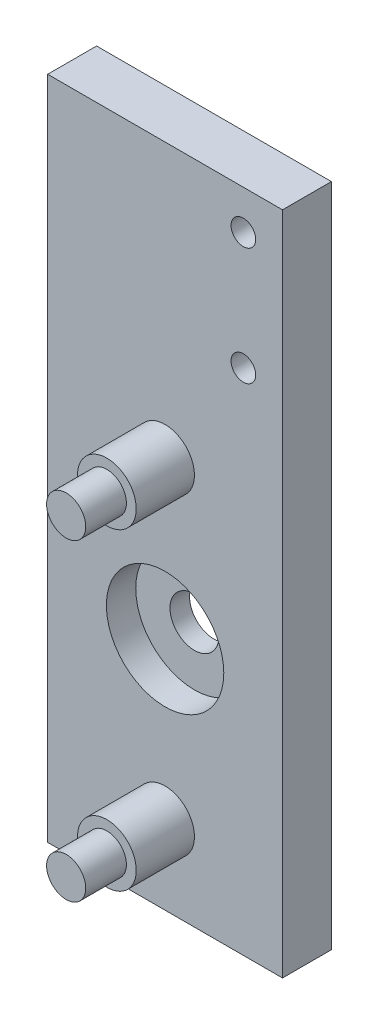
ISO-10303-21;
HEADER;
FILE_DESCRIPTION(('STEP AP214'),'2;1');
FILE_NAME('part.step','',(''),(''),'','','');
FILE_SCHEMA(('AUTOMOTIVE_DESIGN { 1 0 10303 214 1 1 1 1 }'));
ENDSEC;
DATA;
#1=APPLICATION_CONTEXT('core data for automotive mechanical design processes');
#2=APPLICATION_PROTOCOL_DEFINITION('international standard','automotive_design',2000,#1);
#3=PRODUCT_CONTEXT('',#1,'mechanical');
#4=PRODUCT('Part','Part','',(#3));
#5=PRODUCT_RELATED_PRODUCT_CATEGORY('part','',(#4));
#6=PRODUCT_DEFINITION_FORMATION('','',#4);
#7=PRODUCT_DEFINITION_CONTEXT('part definition',#1,'design');
#8=PRODUCT_DEFINITION('design','',#6,#7);
#9=PRODUCT_DEFINITION_SHAPE('','',#8);
#10=(LENGTH_UNIT() NAMED_UNIT(*) SI_UNIT(.MILLI.,.METRE.));
#11=(NAMED_UNIT(*) PLANE_ANGLE_UNIT() SI_UNIT($,.RADIAN.));
#12=(NAMED_UNIT(*) SI_UNIT($,.STERADIAN.) SOLID_ANGLE_UNIT());
#13=UNCERTAINTY_MEASURE_WITH_UNIT(LENGTH_MEASURE(1.E-05),#10,'distance_accuracy_value','');
#14=(GEOMETRIC_REPRESENTATION_CONTEXT(3) GLOBAL_UNCERTAINTY_ASSIGNED_CONTEXT((#13)) GLOBAL_UNIT_ASSIGNED_CONTEXT((#10,
#11,#12)) REPRESENTATION_CONTEXT('',''));
#15=CARTESIAN_POINT('',(0.,0.,0.));
#16=DIRECTION('',(0.,0.,1.));
#17=DIRECTION('',(1.,0.,0.));
#18=AXIS2_PLACEMENT_3D('',#15,#16,#17);
#19=CARTESIAN_POINT('',(19.05,-38.1,7.9375));
#20=DIRECTION('',(-1.,0.,0.));
#21=DIRECTION('',(0.,0.,1.));
#22=AXIS2_PLACEMENT_3D('',#19,#20,#21);
#23=PLANE('',#22);
#24=DIRECTION('',(0.,1.,0.));
#25=VECTOR('',#24,1.);
#26=CARTESIAN_POINT('',(19.05,-38.1,0.));
#27=LINE('',#26,#25);
#28=CARTESIAN_POINT('',(19.05,-38.1,0.));
#29=VERTEX_POINT('',#28);
#30=CARTESIAN_POINT('',(19.05,69.85,0.));
#31=VERTEX_POINT('',#30);
#32=EDGE_CURVE('E78',#29,#31,#27,.T.);
#33=ORIENTED_EDGE('',*,*,#32,.T.);
#34=DIRECTION('',(0.,0.,1.));
#35=VECTOR('',#34,1.);
#36=CARTESIAN_POINT('',(19.05,69.85,-49.5950854420072));
#37=LINE('',#36,#35);
#38=CARTESIAN_POINT('',(19.05,69.85,7.9375));
#39=VERTEX_POINT('',#38);
#40=EDGE_CURVE('E101',#31,#39,#37,.T.);
#41=ORIENTED_EDGE('',*,*,#40,.T.);
#42=DIRECTION('',(0.,1.,0.));
#43=VECTOR('',#42,1.);
#44=CARTESIAN_POINT('',(19.05,-38.1,7.9375));
#45=LINE('',#44,#43);
#46=CARTESIAN_POINT('',(19.05,-38.1,7.9375));
#47=VERTEX_POINT('',#46);
#48=EDGE_CURVE('E93',#47,#39,#45,.T.);
#49=ORIENTED_EDGE('',*,*,#48,.F.);
#50=DIRECTION('',(0.,0.,-1.));
#51=VECTOR('',#50,1.);
#52=CARTESIAN_POINT('',(19.05,-38.1,7.9375));
#53=LINE('',#52,#51);
#54=EDGE_CURVE('E153',#47,#29,#53,.T.);
#55=ORIENTED_EDGE('',*,*,#54,.T.);
#56=EDGE_LOOP('',(#33,#41,#49,#55));
#57=FACE_BOUND('',#56,.T.);
#58=ADVANCED_FACE('F41',(#57),#23,.F.);
#59=CARTESIAN_POINT('',(-19.05,-38.1,7.9375));
#60=DIRECTION('',(1.,0.,0.));
#61=DIRECTION('',(0.,0.,-1.));
#62=AXIS2_PLACEMENT_3D('',#59,#60,#61);
#63=PLANE('',#62);
#64=DIRECTION('',(0.,-1.,0.));
#65=VECTOR('',#64,1.);
#66=CARTESIAN_POINT('',(-19.05,-38.1,0.));
#67=LINE('',#66,#65);
#68=CARTESIAN_POINT('',(-19.05,69.85,0.));
#69=VERTEX_POINT('',#68);
#70=CARTESIAN_POINT('',(-19.05,-38.1,0.));
#71=VERTEX_POINT('',#70);
#72=EDGE_CURVE('E69',#69,#71,#67,.T.);
#73=ORIENTED_EDGE('',*,*,#72,.T.);
#74=DIRECTION('',(0.,0.,-1.));
#75=VECTOR('',#74,1.);
#76=CARTESIAN_POINT('',(-19.05,-38.1,7.9375));
#77=LINE('',#76,#75);
#78=CARTESIAN_POINT('',(-19.05,-38.1,7.9375));
#79=VERTEX_POINT('',#78);
#80=EDGE_CURVE('E91',#79,#71,#77,.T.);
#81=ORIENTED_EDGE('',*,*,#80,.F.);
#82=DIRECTION('',(0.,-1.,0.));
#83=VECTOR('',#82,1.);
#84=CARTESIAN_POINT('',(-19.05,-38.1,7.9375));
#85=LINE('',#84,#83);
#86=CARTESIAN_POINT('',(-19.05,69.85,7.9375));
#87=VERTEX_POINT('',#86);
#88=EDGE_CURVE('E86',#87,#79,#85,.T.);
#89=ORIENTED_EDGE('',*,*,#88,.F.);
#90=DIRECTION('',(0.,0.,1.));
#91=VECTOR('',#90,1.);
#92=CARTESIAN_POINT('',(-19.05,69.85,-49.5950854420072));
#93=LINE('',#92,#91);
#94=EDGE_CURVE('E89',#69,#87,#93,.T.);
#95=ORIENTED_EDGE('',*,*,#94,.F.);
#96=EDGE_LOOP('',(#73,#81,#89,#95));
#97=FACE_BOUND('',#96,.T.);
#98=ADVANCED_FACE('F88',(#97),#63,.F.);
#99=CARTESIAN_POINT('',(-19.05,-38.1,7.9375));
#100=DIRECTION('',(0.,1.,0.));
#101=DIRECTION('',(0.,0.,1.));
#102=AXIS2_PLACEMENT_3D('',#99,#100,#101);
#103=PLANE('',#102);
#104=DIRECTION('',(1.,0.,0.));
#105=VECTOR('',#104,1.);
#106=CARTESIAN_POINT('',(-19.05,-38.1,0.));
#107=LINE('',#106,#105);
#108=EDGE_CURVE('E150',#71,#29,#107,.T.);
#109=ORIENTED_EDGE('',*,*,#108,.T.);
#110=ORIENTED_EDGE('',*,*,#54,.F.);
#111=DIRECTION('',(1.,0.,0.));
#112=VECTOR('',#111,1.);
#113=CARTESIAN_POINT('',(-19.05,-38.1,7.9375));
#114=LINE('',#113,#112);
#115=EDGE_CURVE('E58',#79,#47,#114,.T.);
#116=ORIENTED_EDGE('',*,*,#115,.F.);
#117=ORIENTED_EDGE('',*,*,#80,.T.);
#118=EDGE_LOOP('',(#109,#110,#116,#117));
#119=FACE_BOUND('',#118,.T.);
#120=ADVANCED_FACE('F183',(#119),#103,.F.);
#121=CARTESIAN_POINT('',(0.,0.,7.9375));
#122=DIRECTION('',(0.,0.,-1.));
#123=DIRECTION('',(-1.,0.,0.));
#124=AXIS2_PLACEMENT_3D('',#121,#122,#123);
#125=PLANE('',#124);
#126=CARTESIAN_POINT('',(0.,-25.4,7.9375));
#127=DIRECTION('',(0.,0.,-1.));
#128=DIRECTION('',(1.,0.,0.));
#129=AXIS2_PLACEMENT_3D('',#126,#127,#128);
#130=CIRCLE('',#129,4.7625);
#131=CARTESIAN_POINT('',(4.7625,-25.4,7.9375));
#132=VERTEX_POINT('',#131);
#133=EDGE_CURVE('E126',#132,#132,#130,.T.);
#134=ORIENTED_EDGE('',*,*,#133,.T.);
#135=EDGE_LOOP('',(#134));
#136=FACE_BOUND('',#135,.T.);
#137=CARTESIAN_POINT('',(0.,25.4,7.9375));
#138=DIRECTION('',(0.,0.,-1.));
#139=DIRECTION('',(-1.,0.,0.));
#140=AXIS2_PLACEMENT_3D('',#137,#138,#139);
#141=CIRCLE('',#140,4.7625);
#142=CARTESIAN_POINT('',(-4.7625,25.4,7.9375));
#143=VERTEX_POINT('',#142);
#144=EDGE_CURVE('E44',#143,#143,#141,.F.);
#145=ORIENTED_EDGE('',*,*,#144,.F.);
#146=EDGE_LOOP('',(#145));
#147=FACE_BOUND('',#146,.T.);
#148=CARTESIAN_POINT('',(0.,0.,7.9375));
#149=DIRECTION('',(0.,0.,1.));
#150=DIRECTION('',(1.,0.,0.));
#151=AXIS2_PLACEMENT_3D('',#148,#149,#150);
#152=CIRCLE('',#151,9.525);
#153=CARTESIAN_POINT('',(9.525,0.,7.9375));
#154=VERTEX_POINT('',#153);
#155=EDGE_CURVE('E140',#154,#154,#152,.T.);
#156=ORIENTED_EDGE('',*,*,#155,.F.);
#157=EDGE_LOOP('',(#156));
#158=FACE_BOUND('',#157,.T.);
#159=ORIENTED_EDGE('',*,*,#48,.T.);
#160=DIRECTION('',(-1.,0.,0.));
#161=VECTOR('',#160,1.);
#162=CARTESIAN_POINT('',(-19.05,69.85,7.9375));
#163=LINE('',#162,#161);
#164=EDGE_CURVE('E99',#39,#87,#163,.T.);
#165=ORIENTED_EDGE('',*,*,#164,.T.);
#166=ORIENTED_EDGE('',*,*,#88,.T.);
#167=ORIENTED_EDGE('',*,*,#115,.T.);
#168=EDGE_LOOP('',(#159,#165,#166,#167));
#169=FACE_BOUND('',#168,.T.);
#170=CARTESIAN_POINT('',(12.7,44.45,7.9375));
#171=DIRECTION('',(0.,0.,1.));
#172=DIRECTION('',(-1.,0.,0.));
#173=AXIS2_PLACEMENT_3D('',#170,#171,#172);
#174=CIRCLE('',#173,2.);
#175=CARTESIAN_POINT('',(10.7,44.45,7.9375));
#176=VERTEX_POINT('',#175);
#177=EDGE_CURVE('E107',#176,#176,#174,.T.);
#178=ORIENTED_EDGE('',*,*,#177,.F.);
#179=EDGE_LOOP('',(#178));
#180=FACE_BOUND('',#179,.T.);
#181=CARTESIAN_POINT('',(12.7,63.5,7.9375));
#182=DIRECTION('',(0.,0.,1.));
#183=DIRECTION('',(1.,0.,0.));
#184=AXIS2_PLACEMENT_3D('',#181,#182,#183);
#185=CIRCLE('',#184,2.);
#186=CARTESIAN_POINT('',(14.7,63.5,7.9375));
#187=VERTEX_POINT('',#186);
#188=EDGE_CURVE('E113',#187,#187,#185,.T.);
#189=ORIENTED_EDGE('',*,*,#188,.F.);
#190=EDGE_LOOP('',(#189));
#191=FACE_BOUND('',#190,.T.);
#192=ADVANCED_FACE('F103',(#136,#147,#158,#169,#180,#191),#125,.F.);
#193=CARTESIAN_POINT('',(0.,0.,0.));
#194=DIRECTION('',(0.,0.,-1.));
#195=DIRECTION('',(-1.,0.,0.));
#196=AXIS2_PLACEMENT_3D('',#193,#194,#195);
#197=PLANE('',#196);
#198=CARTESIAN_POINT('',(0.,0.,0.));
#199=DIRECTION('',(0.,0.,1.));
#200=DIRECTION('',(1.,0.,0.));
#201=AXIS2_PLACEMENT_3D('',#198,#199,#200);
#202=CIRCLE('',#201,3.96875);
#203=CARTESIAN_POINT('',(3.96875,0.,0.));
#204=VERTEX_POINT('',#203);
#205=EDGE_CURVE('E147',#204,#204,#202,.T.);
#206=ORIENTED_EDGE('',*,*,#205,.T.);
#207=EDGE_LOOP('',(#206));
#208=FACE_BOUND('',#207,.T.);
#209=ORIENTED_EDGE('',*,*,#32,.F.);
#210=ORIENTED_EDGE('',*,*,#108,.F.);
#211=ORIENTED_EDGE('',*,*,#72,.F.);
#212=DIRECTION('',(-1.,0.,0.));
#213=VECTOR('',#212,1.);
#214=CARTESIAN_POINT('',(-19.05,69.85,0.));
#215=LINE('',#214,#213);
#216=EDGE_CURVE('E100',#31,#69,#215,.T.);
#217=ORIENTED_EDGE('',*,*,#216,.F.);
#218=EDGE_LOOP('',(#209,#210,#211,#217));
#219=FACE_BOUND('',#218,.T.);
#220=CARTESIAN_POINT('',(12.7,44.45,0.));
#221=DIRECTION('',(0.,0.,-1.));
#222=DIRECTION('',(-1.,0.,0.));
#223=AXIS2_PLACEMENT_3D('',#220,#221,#222);
#224=CIRCLE('',#223,2.);
#225=CARTESIAN_POINT('',(10.7,44.45,0.));
#226=VERTEX_POINT('',#225);
#227=EDGE_CURVE('E106',#226,#226,#224,.F.);
#228=ORIENTED_EDGE('',*,*,#227,.T.);
#229=EDGE_LOOP('',(#228));
#230=FACE_BOUND('',#229,.T.);
#231=CARTESIAN_POINT('',(12.7,63.5,0.));
#232=DIRECTION('',(0.,0.,-1.));
#233=DIRECTION('',(-1.,0.,0.));
#234=AXIS2_PLACEMENT_3D('',#231,#232,#233);
#235=CIRCLE('',#234,2.);
#236=CARTESIAN_POINT('',(10.7,63.5,0.));
#237=VERTEX_POINT('',#236);
#238=EDGE_CURVE('E110',#237,#237,#235,.F.);
#239=ORIENTED_EDGE('',*,*,#238,.T.);
#240=EDGE_LOOP('',(#239));
#241=FACE_BOUND('',#240,.T.);
#242=ADVANCED_FACE('F176',(#208,#219,#230,#241),#197,.T.);
#243=CARTESIAN_POINT('',(0.,0.,0.));
#244=DIRECTION('',(0.,0.,1.));
#245=DIRECTION('',(1.,0.,0.));
#246=AXIS2_PLACEMENT_3D('',#243,#244,#245);
#247=CYLINDRICAL_SURFACE('',#246,3.96875);
#248=CARTESIAN_POINT('',(0.,0.,3.175));
#249=DIRECTION('',(0.,0.,-1.));
#250=DIRECTION('',(-1.,0.,0.));
#251=AXIS2_PLACEMENT_3D('',#248,#249,#250);
#252=CIRCLE('',#251,3.96875);
#253=CARTESIAN_POINT('',(-3.96875,0.,3.175));
#254=VERTEX_POINT('',#253);
#255=EDGE_CURVE('E146',#254,#254,#252,.F.);
#256=ORIENTED_EDGE('',*,*,#255,.T.);
#257=EDGE_LOOP('',(#256));
#258=FACE_BOUND('',#257,.T.);
#259=ORIENTED_EDGE('',*,*,#205,.F.);
#260=EDGE_LOOP('',(#259));
#261=FACE_BOUND('',#260,.T.);
#262=ADVANCED_FACE('F161',(#258,#261),#247,.F.);
#263=CARTESIAN_POINT('',(0.,0.,3.175));
#264=DIRECTION('',(0.,0.,-1.));
#265=DIRECTION('',(-1.,0.,0.));
#266=AXIS2_PLACEMENT_3D('',#263,#264,#265);
#267=PLANE('',#266);
#268=CARTESIAN_POINT('',(0.,0.,3.175));
#269=DIRECTION('',(0.,0.,-1.));
#270=DIRECTION('',(-1.,0.,0.));
#271=AXIS2_PLACEMENT_3D('',#268,#269,#270);
#272=CIRCLE('',#271,9.525);
#273=CARTESIAN_POINT('',(-9.525,0.,3.175));
#274=VERTEX_POINT('',#273);
#275=EDGE_CURVE('E143',#274,#274,#272,.F.);
#276=ORIENTED_EDGE('',*,*,#275,.T.);
#277=EDGE_LOOP('',(#276));
#278=FACE_BOUND('',#277,.T.);
#279=ORIENTED_EDGE('',*,*,#255,.F.);
#280=EDGE_LOOP('',(#279));
#281=FACE_BOUND('',#280,.T.);
#282=ADVANCED_FACE('F164',(#278,#281),#267,.F.);
#283=CARTESIAN_POINT('',(0.,0.,-26.9407683632075));
#284=DIRECTION('',(0.,0.,1.));
#285=DIRECTION('',(1.,0.,0.));
#286=AXIS2_PLACEMENT_3D('',#283,#284,#285);
#287=CYLINDRICAL_SURFACE('',#286,9.525);
#288=ORIENTED_EDGE('',*,*,#155,.T.);
#289=EDGE_LOOP('',(#288));
#290=FACE_BOUND('',#289,.T.);
#291=ORIENTED_EDGE('',*,*,#275,.F.);
#292=EDGE_LOOP('',(#291));
#293=FACE_BOUND('',#292,.T.);
#294=ADVANCED_FACE('F166',(#290,#293),#287,.F.);
#295=CARTESIAN_POINT('',(0.,25.4,17.3863));
#296=DIRECTION('',(0.,0.,-1.));
#297=DIRECTION('',(-1.,0.,0.));
#298=AXIS2_PLACEMENT_3D('',#295,#296,#297);
#299=CYLINDRICAL_SURFACE('',#298,4.7625);
#300=CARTESIAN_POINT('',(0.,25.4,17.3863));
#301=DIRECTION('',(0.,0.,1.));
#302=DIRECTION('',(1.,0.,0.));
#303=AXIS2_PLACEMENT_3D('',#300,#301,#302);
#304=CIRCLE('',#303,4.7625);
#305=CARTESIAN_POINT('',(4.7625,25.4,17.3863));
#306=VERTEX_POINT('',#305);
#307=EDGE_CURVE('E136',#306,#306,#304,.T.);
#308=ORIENTED_EDGE('',*,*,#307,.F.);
#309=EDGE_LOOP('',(#308));
#310=FACE_BOUND('',#309,.T.);
#311=ORIENTED_EDGE('',*,*,#144,.T.);
#312=EDGE_LOOP('',(#311));
#313=FACE_BOUND('',#312,.T.);
#314=ADVANCED_FACE('F173',(#310,#313),#299,.T.);
#315=CARTESIAN_POINT('',(0.,25.4,17.3863));
#316=DIRECTION('',(0.,0.,1.));
#317=DIRECTION('',(1.,0.,0.));
#318=AXIS2_PLACEMENT_3D('',#315,#316,#317);
#319=PLANE('',#318);
#320=CARTESIAN_POINT('',(0.,25.4,17.3863));
#321=DIRECTION('',(0.,0.,1.));
#322=DIRECTION('',(1.,0.,0.));
#323=AXIS2_PLACEMENT_3D('',#320,#321,#322);
#324=CIRCLE('',#323,3.175);
#325=CARTESIAN_POINT('',(-3.175,25.4,17.3863));
#326=VERTEX_POINT('',#325);
#327=EDGE_CURVE('E12',#326,#326,#324,.T.);
#328=ORIENTED_EDGE('',*,*,#327,.F.);
#329=EDGE_LOOP('',(#328));
#330=FACE_BOUND('',#329,.T.);
#331=ORIENTED_EDGE('',*,*,#307,.T.);
#332=EDGE_LOOP('',(#331));
#333=FACE_BOUND('',#332,.T.);
#334=ADVANCED_FACE('F207',(#330,#333),#319,.T.);
#335=CARTESIAN_POINT('',(0.,25.4,23.9903));
#336=DIRECTION('',(0.,0.,-1.));
#337=DIRECTION('',(-1.,0.,0.));
#338=AXIS2_PLACEMENT_3D('',#335,#336,#337);
#339=CYLINDRICAL_SURFACE('',#338,3.175);
#340=CARTESIAN_POINT('',(0.,25.4,23.9903));
#341=DIRECTION('',(0.,0.,1.));
#342=DIRECTION('',(1.,0.,0.));
#343=AXIS2_PLACEMENT_3D('',#340,#341,#342);
#344=CIRCLE('',#343,3.175);
#345=CARTESIAN_POINT('',(-3.175,25.4,23.9903));
#346=VERTEX_POINT('',#345);
#347=EDGE_CURVE('E132',#346,#346,#344,.T.);
#348=CARTESIAN_POINT('',(-3.175,25.4,23.9903));
#349=CARTESIAN_POINT('',(-3.175,25.4,23.9215083333333));
#350=CARTESIAN_POINT('',(-3.175,25.4,23.8527166666667));
#351=CARTESIAN_POINT('',(-3.175,25.4,23.7151333333333));
#352=CARTESIAN_POINT('',(-3.175,25.4,23.6463416666667));
#353=CARTESIAN_POINT('',(-3.175,25.4,23.5087583333333));
#354=CARTESIAN_POINT('',(-3.175,25.4,23.4399666666667));
#355=CARTESIAN_POINT('',(-3.175,25.4,23.3023833333333));
#356=CARTESIAN_POINT('',(-3.175,25.4,23.2335916666667));
#357=CARTESIAN_POINT('',(-3.175,25.4,23.0960083333333));
#358=CARTESIAN_POINT('',(-3.175,25.4,23.0272166666667));
#359=CARTESIAN_POINT('',(-3.175,25.4,22.8896333333333));
#360=CARTESIAN_POINT('',(-3.175,25.4,22.8208416666667));
#361=CARTESIAN_POINT('',(-3.175,25.4,22.6832583333333));
#362=CARTESIAN_POINT('',(-3.175,25.4,22.6144666666667));
#363=CARTESIAN_POINT('',(-3.175,25.4,22.4768833333333));
#364=CARTESIAN_POINT('',(-3.175,25.4,22.4080916666667));
#365=CARTESIAN_POINT('',(-3.175,25.4,22.2705083333333));
#366=CARTESIAN_POINT('',(-3.175,25.4,22.2017166666667));
#367=CARTESIAN_POINT('',(-3.175,25.4,22.0641333333333));
#368=CARTESIAN_POINT('',(-3.175,25.4,21.9953416666667));
#369=CARTESIAN_POINT('',(-3.175,25.4,21.8577583333333));
#370=CARTESIAN_POINT('',(-3.175,25.4,21.7889666666667));
#371=CARTESIAN_POINT('',(-3.175,25.4,21.6513833333333));
#372=CARTESIAN_POINT('',(-3.175,25.4,21.5825916666667));
#373=CARTESIAN_POINT('',(-3.175,25.4,21.4450083333333));
#374=CARTESIAN_POINT('',(-3.175,25.4,21.3762166666667));
#375=CARTESIAN_POINT('',(-3.175,25.4,21.2386333333333));
#376=CARTESIAN_POINT('',(-3.175,25.4,21.1698416666667));
#377=CARTESIAN_POINT('',(-3.175,25.4,21.0322583333333));
#378=CARTESIAN_POINT('',(-3.175,25.4,20.9634666666667));
#379=CARTESIAN_POINT('',(-3.175,25.4,20.8258833333333));
#380=CARTESIAN_POINT('',(-3.175,25.4,20.7570916666667));
#381=CARTESIAN_POINT('',(-3.175,25.4,20.6195083333333));
#382=CARTESIAN_POINT('',(-3.175,25.4,20.5507166666667));
#383=CARTESIAN_POINT('',(-3.175,25.4,20.4131333333333));
#384=CARTESIAN_POINT('',(-3.175,25.4,20.3443416666667));
#385=CARTESIAN_POINT('',(-3.175,25.4,20.2067583333333));
#386=CARTESIAN_POINT('',(-3.175,25.4,20.1379666666667));
#387=CARTESIAN_POINT('',(-3.175,25.4,20.0003833333333));
#388=CARTESIAN_POINT('',(-3.175,25.4,19.9315916666667));
#389=CARTESIAN_POINT('',(-3.175,25.4,19.7940083333333));
#390=CARTESIAN_POINT('',(-3.175,25.4,19.7252166666667));
#391=CARTESIAN_POINT('',(-3.175,25.4,19.5876333333333));
#392=CARTESIAN_POINT('',(-3.175,25.4,19.5188416666667));
#393=CARTESIAN_POINT('',(-3.175,25.4,19.3812583333333));
#394=CARTESIAN_POINT('',(-3.175,25.4,19.3124666666667));
#395=CARTESIAN_POINT('',(-3.175,25.4,19.1748833333333));
#396=CARTESIAN_POINT('',(-3.175,25.4,19.1060916666667));
#397=CARTESIAN_POINT('',(-3.175,25.4,18.9685083333333));
#398=CARTESIAN_POINT('',(-3.175,25.4,18.8997166666667));
#399=CARTESIAN_POINT('',(-3.175,25.4,18.7621333333333));
#400=CARTESIAN_POINT('',(-3.175,25.4,18.6933416666667));
#401=CARTESIAN_POINT('',(-3.175,25.4,18.5557583333333));
#402=CARTESIAN_POINT('',(-3.175,25.4,18.4869666666667));
#403=CARTESIAN_POINT('',(-3.175,25.4,18.3493833333333));
#404=CARTESIAN_POINT('',(-3.175,25.4,18.2805916666667));
#405=CARTESIAN_POINT('',(-3.175,25.4,18.1430083333333));
#406=CARTESIAN_POINT('',(-3.175,25.4,18.0742166666667));
#407=CARTESIAN_POINT('',(-3.175,25.4,17.9366333333333));
#408=CARTESIAN_POINT('',(-3.175,25.4,17.8678416666667));
#409=CARTESIAN_POINT('',(-3.175,25.4,17.7302583333333));
#410=CARTESIAN_POINT('',(-3.175,25.4,17.6614666666667));
#411=CARTESIAN_POINT('',(-3.175,25.4,17.5238833333333));
#412=CARTESIAN_POINT('',(-3.175,25.4,17.4550916666667));
#413=CARTESIAN_POINT('',(-3.175,25.4,17.3863));
#414=B_SPLINE_CURVE_WITH_KNOTS('',3,(#348,#349,#350,#351,#352,#353,#354,#355,#356,#357,#358,
#359,#360,#361,#362,#363,#364,#365,#366,#367,#368,#369,#370,#371,#372,#373,#374,#375,#376,#377,
#378,#379,#380,#381,#382,#383,#384,#385,#386,#387,#388,#389,#390,#391,#392,#393,#394,#395,#396,
#397,#398,#399,#400,#401,#402,#403,#404,#405,#406,#407,#408,#409,#410,#411,#412,#413),
.UNSPECIFIED.,.F.,.F.,(4,2,2,2,2,2,2,2,2,2,2,2,2,2,2,2,2,2,2,2,2,2,2,2,2,2,2,2,2,2,2,2,4),(0.,
0.206374999999998,0.41275,0.619124999999998,0.8255,1.031875,1.23825,1.444625,1.651,1.857375,
2.06375,2.270125,2.4765,2.682875,2.88925,3.095625,3.302,3.508375,3.71475,3.921125,4.1275,
4.333875,4.54025,4.746625,4.953,5.159375,5.36575,5.572125,5.7785,5.984875,6.19125,6.397625,
6.604),.UNSPECIFIED.);
#415=EDGE_CURVE('BSEAM213',#346,#326,#414,.T.);
#416=ORIENTED_EDGE('',*,*,#347,.F.);
#417=ORIENTED_EDGE('',*,*,#327,.T.);
#418=ORIENTED_EDGE('',*,*,#415,.T.);
#419=ORIENTED_EDGE('',*,*,#415,.F.);
#420=EDGE_LOOP('',(#416,#418,#417,#419));
#421=FACE_BOUND('',#420,.T.);
#422=ADVANCED_FACE('F213',(#421),#339,.T.);
#423=CARTESIAN_POINT('',(0.,25.4,23.9903));
#424=DIRECTION('',(0.,0.,1.));
#425=DIRECTION('',(1.,0.,0.));
#426=AXIS2_PLACEMENT_3D('',#423,#424,#425);
#427=PLANE('',#426);
#428=ORIENTED_EDGE('',*,*,#347,.T.);
#429=EDGE_LOOP('',(#428));
#430=FACE_BOUND('',#429,.T.);
#431=ADVANCED_FACE('F220',(#430),#427,.T.);
#432=CARTESIAN_POINT('',(0.,-25.4,17.3863));
#433=DIRECTION('',(0.,0.,-1.));
#434=DIRECTION('',(-1.,0.,0.));
#435=AXIS2_PLACEMENT_3D('',#432,#433,#434);
#436=CYLINDRICAL_SURFACE('',#435,4.7625);
#437=CARTESIAN_POINT('',(0.,-25.4,17.3863));
#438=DIRECTION('',(0.,0.,-1.));
#439=DIRECTION('',(1.,0.,0.));
#440=AXIS2_PLACEMENT_3D('',#437,#438,#439);
#441=CIRCLE('',#440,4.7625);
#442=CARTESIAN_POINT('',(4.7625,-25.4,17.3863));
#443=VERTEX_POINT('',#442);
#444=EDGE_CURVE('E129',#443,#443,#441,.T.);
#445=ORIENTED_EDGE('',*,*,#444,.T.);
#446=EDGE_LOOP('',(#445));
#447=FACE_BOUND('',#446,.T.);
#448=ORIENTED_EDGE('',*,*,#133,.F.);
#449=EDGE_LOOP('',(#448));
#450=FACE_BOUND('',#449,.T.);
#451=ADVANCED_FACE('F224',(#447,#450),#436,.T.);
#452=CARTESIAN_POINT('',(0.,-25.4,17.3863));
#453=DIRECTION('',(0.,0.,1.));
#454=DIRECTION('',(1.,0.,0.));
#455=AXIS2_PLACEMENT_3D('',#452,#453,#454);
#456=PLANE('',#455);
#457=CARTESIAN_POINT('',(0.,-25.4,17.3863));
#458=DIRECTION('',(0.,0.,-1.));
#459=DIRECTION('',(1.,0.,0.));
#460=AXIS2_PLACEMENT_3D('',#457,#458,#459);
#461=CIRCLE('',#460,3.175);
#462=CARTESIAN_POINT('',(-3.175,-25.4,17.3863));
#463=VERTEX_POINT('',#462);
#464=EDGE_CURVE('E119',#463,#463,#461,.T.);
#465=ORIENTED_EDGE('',*,*,#464,.T.);
#466=EDGE_LOOP('',(#465));
#467=FACE_BOUND('',#466,.T.);
#468=ORIENTED_EDGE('',*,*,#444,.F.);
#469=EDGE_LOOP('',(#468));
#470=FACE_BOUND('',#469,.T.);
#471=ADVANCED_FACE('F228',(#467,#470),#456,.T.);
#472=CARTESIAN_POINT('',(0.,-25.4,23.9903));
#473=DIRECTION('',(0.,0.,-1.));
#474=DIRECTION('',(-1.,0.,0.));
#475=AXIS2_PLACEMENT_3D('',#472,#473,#474);
#476=CYLINDRICAL_SURFACE('',#475,3.175);
#477=CARTESIAN_POINT('',(0.,-25.4,23.9903));
#478=DIRECTION('',(0.,0.,-1.));
#479=DIRECTION('',(1.,0.,0.));
#480=AXIS2_PLACEMENT_3D('',#477,#478,#479);
#481=CIRCLE('',#480,3.175);
#482=CARTESIAN_POINT('',(-3.175,-25.4,23.9903));
#483=VERTEX_POINT('',#482);
#484=EDGE_CURVE('E123',#483,#483,#481,.T.);
#485=CARTESIAN_POINT('',(-3.175,-25.4,23.9903));
#486=CARTESIAN_POINT('',(-3.175,-25.4,23.9215083333333));
#487=CARTESIAN_POINT('',(-3.175,-25.4,23.8527166666667));
#488=CARTESIAN_POINT('',(-3.175,-25.4,23.7151333333333));
#489=CARTESIAN_POINT('',(-3.175,-25.4,23.6463416666667));
#490=CARTESIAN_POINT('',(-3.175,-25.4,23.5087583333333));
#491=CARTESIAN_POINT('',(-3.175,-25.4,23.4399666666667));
#492=CARTESIAN_POINT('',(-3.175,-25.4,23.3023833333333));
#493=CARTESIAN_POINT('',(-3.175,-25.4,23.2335916666667));
#494=CARTESIAN_POINT('',(-3.175,-25.4,23.0960083333333));
#495=CARTESIAN_POINT('',(-3.175,-25.4,23.0272166666667));
#496=CARTESIAN_POINT('',(-3.175,-25.4,22.8896333333333));
#497=CARTESIAN_POINT('',(-3.175,-25.4,22.8208416666667));
#498=CARTESIAN_POINT('',(-3.175,-25.4,22.6832583333333));
#499=CARTESIAN_POINT('',(-3.175,-25.4,22.6144666666667));
#500=CARTESIAN_POINT('',(-3.175,-25.4,22.4768833333333));
#501=CARTESIAN_POINT('',(-3.175,-25.4,22.4080916666667));
#502=CARTESIAN_POINT('',(-3.175,-25.4,22.2705083333333));
#503=CARTESIAN_POINT('',(-3.175,-25.4,22.2017166666667));
#504=CARTESIAN_POINT('',(-3.175,-25.4,22.0641333333333));
#505=CARTESIAN_POINT('',(-3.175,-25.4,21.9953416666667));
#506=CARTESIAN_POINT('',(-3.175,-25.4,21.8577583333333));
#507=CARTESIAN_POINT('',(-3.175,-25.4,21.7889666666667));
#508=CARTESIAN_POINT('',(-3.175,-25.4,21.6513833333333));
#509=CARTESIAN_POINT('',(-3.175,-25.4,21.5825916666667));
#510=CARTESIAN_POINT('',(-3.175,-25.4,21.4450083333333));
#511=CARTESIAN_POINT('',(-3.175,-25.4,21.3762166666667));
#512=CARTESIAN_POINT('',(-3.175,-25.4,21.2386333333333));
#513=CARTESIAN_POINT('',(-3.175,-25.4,21.1698416666667));
#514=CARTESIAN_POINT('',(-3.175,-25.4,21.0322583333333));
#515=CARTESIAN_POINT('',(-3.175,-25.4,20.9634666666667));
#516=CARTESIAN_POINT('',(-3.175,-25.4,20.8258833333333));
#517=CARTESIAN_POINT('',(-3.175,-25.4,20.7570916666667));
#518=CARTESIAN_POINT('',(-3.175,-25.4,20.6195083333333));
#519=CARTESIAN_POINT('',(-3.175,-25.4,20.5507166666667));
#520=CARTESIAN_POINT('',(-3.175,-25.4,20.4131333333333));
#521=CARTESIAN_POINT('',(-3.175,-25.4,20.3443416666667));
#522=CARTESIAN_POINT('',(-3.175,-25.4,20.2067583333333));
#523=CARTESIAN_POINT('',(-3.175,-25.4,20.1379666666667));
#524=CARTESIAN_POINT('',(-3.175,-25.4,20.0003833333333));
#525=CARTESIAN_POINT('',(-3.175,-25.4,19.9315916666667));
#526=CARTESIAN_POINT('',(-3.175,-25.4,19.7940083333333));
#527=CARTESIAN_POINT('',(-3.175,-25.4,19.7252166666667));
#528=CARTESIAN_POINT('',(-3.175,-25.4,19.5876333333333));
#529=CARTESIAN_POINT('',(-3.175,-25.4,19.5188416666667));
#530=CARTESIAN_POINT('',(-3.175,-25.4,19.3812583333333));
#531=CARTESIAN_POINT('',(-3.175,-25.4,19.3124666666667));
#532=CARTESIAN_POINT('',(-3.175,-25.4,19.1748833333333));
#533=CARTESIAN_POINT('',(-3.175,-25.4,19.1060916666667));
#534=CARTESIAN_POINT('',(-3.175,-25.4,18.9685083333333));
#535=CARTESIAN_POINT('',(-3.175,-25.4,18.8997166666667));
#536=CARTESIAN_POINT('',(-3.175,-25.4,18.7621333333333));
#537=CARTESIAN_POINT('',(-3.175,-25.4,18.6933416666667));
#538=CARTESIAN_POINT('',(-3.175,-25.4,18.5557583333333));
#539=CARTESIAN_POINT('',(-3.175,-25.4,18.4869666666667));
#540=CARTESIAN_POINT('',(-3.175,-25.4,18.3493833333333));
#541=CARTESIAN_POINT('',(-3.175,-25.4,18.2805916666667));
#542=CARTESIAN_POINT('',(-3.175,-25.4,18.1430083333333));
#543=CARTESIAN_POINT('',(-3.175,-25.4,18.0742166666667));
#544=CARTESIAN_POINT('',(-3.175,-25.4,17.9366333333333));
#545=CARTESIAN_POINT('',(-3.175,-25.4,17.8678416666667));
#546=CARTESIAN_POINT('',(-3.175,-25.4,17.7302583333333));
#547=CARTESIAN_POINT('',(-3.175,-25.4,17.6614666666667));
#548=CARTESIAN_POINT('',(-3.175,-25.4,17.5238833333333));
#549=CARTESIAN_POINT('',(-3.175,-25.4,17.4550916666667));
#550=CARTESIAN_POINT('',(-3.175,-25.4,17.3863));
#551=B_SPLINE_CURVE_WITH_KNOTS('',3,(#485,#486,#487,#488,#489,#490,#491,#492,#493,#494,#495,
#496,#497,#498,#499,#500,#501,#502,#503,#504,#505,#506,#507,#508,#509,#510,#511,#512,#513,#514,
#515,#516,#517,#518,#519,#520,#521,#522,#523,#524,#525,#526,#527,#528,#529,#530,#531,#532,#533,
#534,#535,#536,#537,#538,#539,#540,#541,#542,#543,#544,#545,#546,#547,#548,#549,#550),
.UNSPECIFIED.,.F.,.F.,(4,2,2,2,2,2,2,2,2,2,2,2,2,2,2,2,2,2,2,2,2,2,2,2,2,2,2,2,2,2,2,2,4),(0.,
0.206374999999998,0.412749999999996,0.619124999999998,0.825499999999996,1.031875,1.23825,
1.444625,1.651,1.857375,2.06375,2.270125,2.4765,2.682875,2.88925,3.095625,3.302,3.508375,
3.71475,3.921125,4.1275,4.333875,4.54025,4.746625,4.953,5.159375,5.36575,5.572125,5.7785,
5.984875,6.19125,6.397625,6.604),.UNSPECIFIED.);
#552=EDGE_CURVE('BSEAM232',#483,#463,#551,.T.);
#553=ORIENTED_EDGE('',*,*,#484,.T.);
#554=ORIENTED_EDGE('',*,*,#464,.F.);
#555=ORIENTED_EDGE('',*,*,#552,.T.);
#556=ORIENTED_EDGE('',*,*,#552,.F.);
#557=EDGE_LOOP('',(#553,#555,#554,#556));
#558=FACE_BOUND('',#557,.T.);
#559=ADVANCED_FACE('F232',(#558),#476,.T.);
#560=CARTESIAN_POINT('',(0.,-25.4,23.9903));
#561=DIRECTION('',(0.,0.,1.));
#562=DIRECTION('',(1.,0.,0.));
#563=AXIS2_PLACEMENT_3D('',#560,#561,#562);
#564=PLANE('',#563);
#565=ORIENTED_EDGE('',*,*,#484,.F.);
#566=EDGE_LOOP('',(#565));
#567=FACE_BOUND('',#566,.T.);
#568=ADVANCED_FACE('F236',(#567),#564,.T.);
#569=CARTESIAN_POINT('',(-19.05,69.85,-49.5950854420072));
#570=DIRECTION('',(0.,1.,0.));
#571=DIRECTION('',(0.,0.,1.));
#572=AXIS2_PLACEMENT_3D('',#569,#570,#571);
#573=PLANE('',#572);
#574=ORIENTED_EDGE('',*,*,#40,.F.);
#575=ORIENTED_EDGE('',*,*,#216,.T.);
#576=ORIENTED_EDGE('',*,*,#94,.T.);
#577=ORIENTED_EDGE('',*,*,#164,.F.);
#578=EDGE_LOOP('',(#574,#575,#576,#577));
#579=FACE_BOUND('',#578,.T.);
#580=ADVANCED_FACE('F98',(#579),#573,.T.);
#581=CARTESIAN_POINT('',(12.7,63.5,-49.5950854420072));
#582=DIRECTION('',(0.,0.,1.));
#583=DIRECTION('',(1.,0.,0.));
#584=AXIS2_PLACEMENT_3D('',#581,#582,#583);
#585=CYLINDRICAL_SURFACE('',#584,2.);
#586=ORIENTED_EDGE('',*,*,#188,.T.);
#587=EDGE_LOOP('',(#586));
#588=FACE_BOUND('',#587,.T.);
#589=ORIENTED_EDGE('',*,*,#238,.F.);
#590=EDGE_LOOP('',(#589));
#591=FACE_BOUND('',#590,.T.);
#592=ADVANCED_FACE('F243',(#588,#591),#585,.F.);
#593=CARTESIAN_POINT('',(12.7,44.45,-49.5950854420072));
#594=DIRECTION('',(0.,0.,1.));
#595=DIRECTION('',(1.,0.,0.));
#596=AXIS2_PLACEMENT_3D('',#593,#594,#595);
#597=CYLINDRICAL_SURFACE('',#596,2.);
#598=ORIENTED_EDGE('',*,*,#177,.T.);
#599=EDGE_LOOP('',(#598));
#600=FACE_BOUND('',#599,.T.);
#601=ORIENTED_EDGE('',*,*,#227,.F.);
#602=EDGE_LOOP('',(#601));
#603=FACE_BOUND('',#602,.T.);
#604=ADVANCED_FACE('F240',(#600,#603),#597,.F.);
#605=CLOSED_SHELL('',(#58,#98,#120,#192,#242,#262,#282,#294,#314,#334,#422,#431,#451,#471,#559,
#568,#580,#592,#604));
#606=MANIFOLD_SOLID_BREP('B2',#605);
#607=ADVANCED_BREP_SHAPE_REPRESENTATION('',(#18,#606),#14);
#608=SHAPE_DEFINITION_REPRESENTATION(#9,#607);
ENDSEC;
END-ISO-10303-21;
